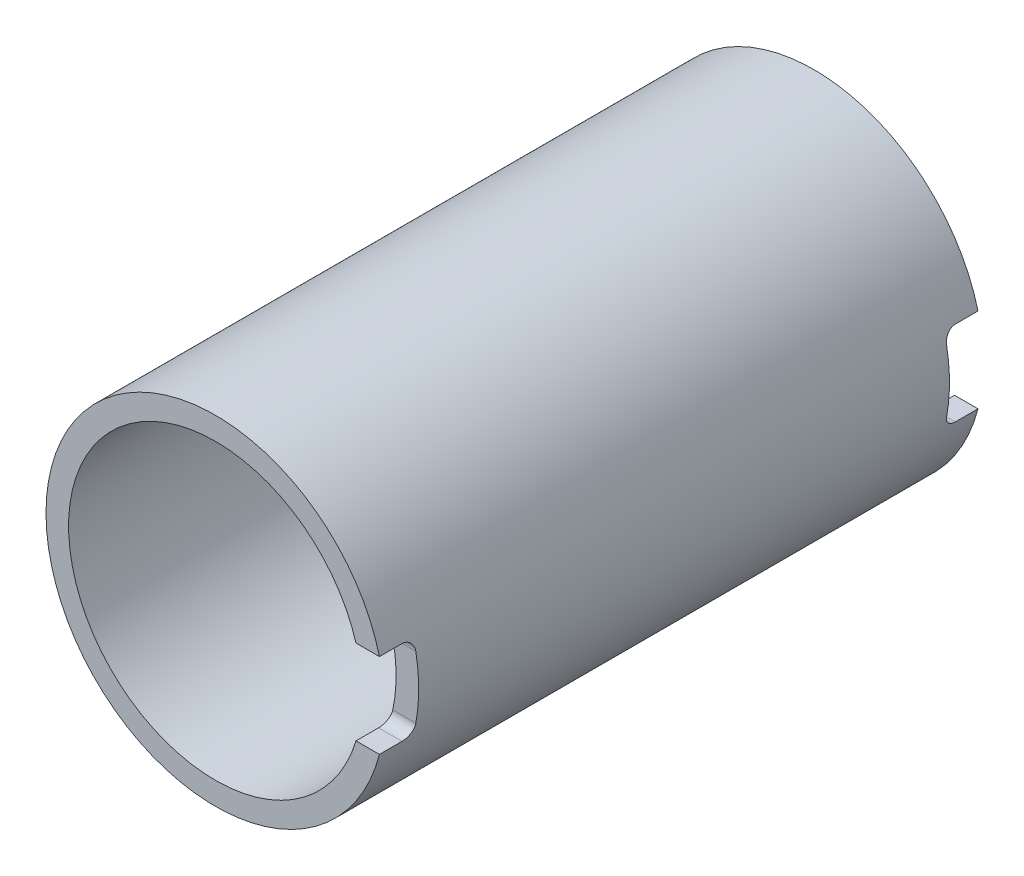
ISO-10303-21;
HEADER;
FILE_DESCRIPTION(('STEP AP214'),'2;1');
FILE_NAME('part.step','',(''),(''),'','','');
FILE_SCHEMA(('AUTOMOTIVE_DESIGN { 1 0 10303 214 1 1 1 1 }'));
ENDSEC;
DATA;
#1=APPLICATION_CONTEXT('core data for automotive mechanical design processes');
#2=APPLICATION_PROTOCOL_DEFINITION('international standard','automotive_design',2000,#1);
#3=PRODUCT_CONTEXT('',#1,'mechanical');
#4=PRODUCT('Part','Part','',(#3));
#5=PRODUCT_RELATED_PRODUCT_CATEGORY('part','',(#4));
#6=PRODUCT_DEFINITION_FORMATION('','',#4);
#7=PRODUCT_DEFINITION_CONTEXT('part definition',#1,'design');
#8=PRODUCT_DEFINITION('design','',#6,#7);
#9=PRODUCT_DEFINITION_SHAPE('','',#8);
#10=(LENGTH_UNIT() NAMED_UNIT(*) SI_UNIT(.MILLI.,.METRE.));
#11=(NAMED_UNIT(*) PLANE_ANGLE_UNIT() SI_UNIT($,.RADIAN.));
#12=(NAMED_UNIT(*) SI_UNIT($,.STERADIAN.) SOLID_ANGLE_UNIT());
#13=UNCERTAINTY_MEASURE_WITH_UNIT(LENGTH_MEASURE(1.E-05),#10,'distance_accuracy_value','');
#14=(GEOMETRIC_REPRESENTATION_CONTEXT(3) GLOBAL_UNCERTAINTY_ASSIGNED_CONTEXT((#13)) GLOBAL_UNIT_ASSIGNED_CONTEXT((#10,
#11,#12)) REPRESENTATION_CONTEXT('',''));
#15=CARTESIAN_POINT('',(0.,0.,0.));
#16=DIRECTION('',(0.,0.,1.));
#17=DIRECTION('',(1.,0.,0.));
#18=AXIS2_PLACEMENT_3D('',#15,#16,#17);
#19=CARTESIAN_POINT('',(0.,0.,26.5));
#20=DIRECTION('',(0.,0.,1.));
#21=DIRECTION('',(1.,0.,0.));
#22=AXIS2_PLACEMENT_3D('',#19,#20,#21);
#23=PLANE('',#22);
#24=CARTESIAN_POINT('',(0.,0.,26.5));
#25=DIRECTION('',(0.,0.,1.));
#26=DIRECTION('',(1.,0.,0.));
#27=AXIS2_PLACEMENT_3D('',#24,#25,#26);
#28=CIRCLE('',#27,15.);
#29=CARTESIAN_POINT('',(14.5236875482778,3.75,26.5));
#30=VERTEX_POINT('',#29);
#31=CARTESIAN_POINT('',(14.5236875482778,-3.75,26.5));
#32=VERTEX_POINT('',#31);
#33=EDGE_CURVE('E11',#30,#32,#28,.T.);
#34=ORIENTED_EDGE('',*,*,#33,.T.);
#35=DIRECTION('',(-1.,0.,0.));
#36=VECTOR('',#35,1.);
#37=CARTESIAN_POINT('',(15.001,-3.75,26.5));
#38=LINE('',#37,#36);
#39=CARTESIAN_POINT('',(12.4473892845046,-3.75,26.5));
#40=VERTEX_POINT('',#39);
#41=EDGE_CURVE('E141',#32,#40,#38,.T.);
#42=ORIENTED_EDGE('',*,*,#41,.T.);
#43=CARTESIAN_POINT('',(0.,0.,26.5));
#44=DIRECTION('',(0.,0.,1.));
#45=DIRECTION('',(1.,0.,0.));
#46=AXIS2_PLACEMENT_3D('',#43,#44,#45);
#47=CIRCLE('',#46,13.);
#48=CARTESIAN_POINT('',(12.4473892845046,3.75,26.5));
#49=VERTEX_POINT('',#48);
#50=EDGE_CURVE('E272',#49,#40,#47,.T.);
#51=ORIENTED_EDGE('',*,*,#50,.F.);
#52=DIRECTION('',(-1.,0.,0.));
#53=VECTOR('',#52,1.);
#54=CARTESIAN_POINT('',(15.001,3.75,26.5));
#55=LINE('',#54,#53);
#56=EDGE_CURVE('E56',#30,#49,#55,.T.);
#57=ORIENTED_EDGE('',*,*,#56,.F.);
#58=EDGE_LOOP('',(#34,#42,#51,#57));
#59=FACE_BOUND('',#58,.T.);
#60=ADVANCED_FACE('F33',(#59),#23,.T.);
#61=CARTESIAN_POINT('',(0.,0.,-26.5));
#62=DIRECTION('',(0.,0.,1.));
#63=DIRECTION('',(1.,0.,0.));
#64=AXIS2_PLACEMENT_3D('',#61,#62,#63);
#65=PLANE('',#64);
#66=DIRECTION('',(-1.,0.,0.));
#67=VECTOR('',#66,1.);
#68=CARTESIAN_POINT('',(15.001,3.75,-26.5));
#69=LINE('',#68,#67);
#70=CARTESIAN_POINT('',(14.5236875482778,3.75,-26.5));
#71=VERTEX_POINT('',#70);
#72=CARTESIAN_POINT('',(12.4473892845046,3.75,-26.5));
#73=VERTEX_POINT('',#72);
#74=EDGE_CURVE('E268',#71,#73,#69,.T.);
#75=ORIENTED_EDGE('',*,*,#74,.T.);
#76=CARTESIAN_POINT('',(0.,0.,-26.5));
#77=DIRECTION('',(0.,0.,1.));
#78=DIRECTION('',(1.,0.,0.));
#79=AXIS2_PLACEMENT_3D('',#76,#77,#78);
#80=CIRCLE('',#79,13.);
#81=CARTESIAN_POINT('',(12.4473892845046,-3.75,-26.5));
#82=VERTEX_POINT('',#81);
#83=EDGE_CURVE('E208',#73,#82,#80,.T.);
#84=ORIENTED_EDGE('',*,*,#83,.T.);
#85=DIRECTION('',(-1.,0.,0.));
#86=VECTOR('',#85,1.);
#87=CARTESIAN_POINT('',(15.001,-3.75,-26.5));
#88=LINE('',#87,#86);
#89=CARTESIAN_POINT('',(14.5236875482778,-3.75,-26.5));
#90=VERTEX_POINT('',#89);
#91=EDGE_CURVE('E48',#90,#82,#88,.T.);
#92=ORIENTED_EDGE('',*,*,#91,.F.);
#93=CARTESIAN_POINT('',(0.,0.,-26.5));
#94=DIRECTION('',(0.,0.,1.));
#95=DIRECTION('',(1.,0.,0.));
#96=AXIS2_PLACEMENT_3D('',#93,#94,#95);
#97=CIRCLE('',#96,15.);
#98=EDGE_CURVE('E37',#71,#90,#97,.T.);
#99=ORIENTED_EDGE('',*,*,#98,.F.);
#100=EDGE_LOOP('',(#75,#84,#92,#99));
#101=FACE_BOUND('',#100,.T.);
#102=ADVANCED_FACE('F277',(#101),#65,.F.);
#103=CARTESIAN_POINT('',(0.,0.,26.5));
#104=DIRECTION('',(0.,0.,-1.));
#105=DIRECTION('',(-1.,0.,0.));
#106=AXIS2_PLACEMENT_3D('',#103,#104,#105);
#107=CYLINDRICAL_SURFACE('',#106,15.);
#108=DIRECTION('',(0.,0.,-1.));
#109=VECTOR('',#108,1.);
#110=CARTESIAN_POINT('',(14.5236875482778,3.75,26.5));
#111=LINE('',#110,#109);
#112=CARTESIAN_POINT('',(14.5236875482778,3.75,-24.5));
#113=VERTEX_POINT('',#112);
#114=EDGE_CURVE('E255',#113,#71,#111,.T.);
#115=ORIENTED_EDGE('',*,*,#114,.T.);
#116=ORIENTED_EDGE('',*,*,#98,.T.);
#117=DIRECTION('',(0.,0.,-1.));
#118=VECTOR('',#117,1.);
#119=CARTESIAN_POINT('',(14.5236875482778,-3.75,26.5));
#120=LINE('',#119,#118);
#121=CARTESIAN_POINT('',(14.5236875482778,-3.75,-24.5));
#122=VERTEX_POINT('',#121);
#123=EDGE_CURVE('E147',#90,#122,#120,.F.);
#124=ORIENTED_EDGE('',*,*,#123,.T.);
#125=CARTESIAN_POINT('',(14.5236875482778,-3.75,-24.5));
#126=CARTESIAN_POINT('',(14.523687009346,-3.75000029271838,-24.4724618045762));
#127=CARTESIAN_POINT('',(14.5239814992384,-3.7488617268363,-24.4449370948382));
#128=CARTESIAN_POINT('',(14.5251525154417,-3.74432270963277,-24.3900907800128));
#129=CARTESIAN_POINT('',(14.5260289676267,-3.74092254637627,-24.3627691495068));
#130=CARTESIAN_POINT('',(14.5295131894071,-3.72737692588563,-24.2815062127906));
#131=CARTESIAN_POINT('',(14.5329759139886,-3.71388614181603,-24.2281191732213));
#132=CARTESIAN_POINT('',(14.5419914215567,-3.67842570469678,-24.1244583399101));
#133=CARTESIAN_POINT('',(14.5475444071387,-3.65645522976012,-24.0741848484946));
#134=CARTESIAN_POINT('',(14.5604480315263,-3.60472761193206,-23.9780625477194));
#135=CARTESIAN_POINT('',(14.5677989066021,-3.5749694455819,-23.9322143210132));
#136=CARTESIAN_POINT('',(14.5840650278986,-3.50802634178349,-23.8454415800296));
#137=CARTESIAN_POINT('',(14.5930031073876,-3.47073172742425,-23.8046060729825));
#138=CARTESIAN_POINT('',(14.6119495721043,-3.39008010416391,-23.7297230364728));
#139=CARTESIAN_POINT('',(14.6219582514298,-3.34672142843173,-23.6956773796023));
#140=CARTESIAN_POINT('',(14.642914605047,-3.25382538889646,-23.6343528187069));
#141=CARTESIAN_POINT('',(14.6538808288068,-3.2041479760962,-23.6072924884732));
#142=CARTESIAN_POINT('',(14.6760538910628,-3.10100304025908,-23.561933947493));
#143=CARTESIAN_POINT('',(14.6872606340417,-3.04753700307032,-23.5436323232953));
#144=CARTESIAN_POINT('',(14.7064587463132,-2.95325409497605,-23.5200194788427));
#145=CARTESIAN_POINT('',(14.7144910138095,-2.91297829202584,-23.5125241642182));
#146=CARTESIAN_POINT('',(14.7303270734774,-2.83181828889743,-23.5025137130429));
#147=CARTESIAN_POINT('',(14.7381311210959,-2.7909348527501,-23.4999927806249));
#148=CARTESIAN_POINT('',(14.7457621030586,-2.75,-23.5));
#149=B_SPLINE_CURVE_WITH_KNOTS('',3,(#125,#126,#127,#128,#129,#130,#131,#132,#133,#134,#135,
#136,#137,#138,#139,#140,#141,#142,#143,#144,#145,#146,#147,#148),.UNSPECIFIED.,.F.,.F.,(4,2,2,
2,2,2,2,2,2,2,2,4),(0.,0.0825628613874054,0.165115208563593,0.32978258198036,0.494465919655328,
0.659170910900011,0.826472217851638,0.993819601694428,1.16589921763363,1.33791171581839,
1.46286599844592,1.58767460528488),.UNSPECIFIED.);
#150=CARTESIAN_POINT('',(14.7457621030586,-2.75,-23.5));
#151=VERTEX_POINT('',#150);
#152=EDGE_CURVE('E292',#122,#151,#149,.T.);
#153=ORIENTED_EDGE('',*,*,#152,.T.);
#154=CARTESIAN_POINT('',(0.,0.,-23.5));
#155=DIRECTION('',(0.,0.,-1.));
#156=DIRECTION('',(-1.,0.,0.));
#157=AXIS2_PLACEMENT_3D('',#154,#155,#156);
#158=CIRCLE('',#157,15.);
#159=CARTESIAN_POINT('',(14.7457621030586,2.74999999999999,-23.5));
#160=VERTEX_POINT('',#159);
#161=EDGE_CURVE('E256',#151,#160,#158,.F.);
#162=ORIENTED_EDGE('',*,*,#161,.T.);
#163=CARTESIAN_POINT('',(14.7457621030586,2.74999999999999,-23.5));
#164=CARTESIAN_POINT('',(14.7350763742763,2.80736888679508,-23.4999581559532));
#165=CARTESIAN_POINT('',(14.724034352876,2.86465078887561,-23.5049338830027));
#166=CARTESIAN_POINT('',(14.7016339649438,2.97744165987913,-23.5245400997557));
#167=CARTESIAN_POINT('',(14.6902757843541,3.0329516313381,-23.5391650247902));
#168=CARTESIAN_POINT('',(14.6676220949194,3.14068847255192,-23.5776968986634));
#169=CARTESIAN_POINT('',(14.6563266096963,3.19291417253336,-23.6016071331775));
#170=CARTESIAN_POINT('',(14.6342562885019,3.29258916168966,-23.6580529060841));
#171=CARTESIAN_POINT('',(14.623481371049,3.34003919963898,-23.6905870894146));
#172=CARTESIAN_POINT('',(14.6029439437899,3.42871720772926,-23.7633672491207));
#173=CARTESIAN_POINT('',(14.5931796904903,3.46995595086186,-23.8035995918559));
#174=CARTESIAN_POINT('',(14.575117552037,3.5450590864144,-23.890747530651));
#175=CARTESIAN_POINT('',(14.5668198272081,3.57892267265592,-23.9376638564108));
#176=CARTESIAN_POINT('',(14.5522862825615,3.63756259334756,-24.035847169761));
#177=CARTESIAN_POINT('',(14.5460122578745,3.66250840521519,-24.087007346503));
#178=CARTESIAN_POINT('',(14.5356564816767,3.70339570745404,-24.1929913644555));
#179=CARTESIAN_POINT('',(14.5315725039703,3.71934634233057,-24.2478114213713));
#180=CARTESIAN_POINT('',(14.5270400411812,3.73699749786692,-24.3359108465384));
#181=CARTESIAN_POINT('',(14.5257848928519,3.74187008163745,-24.3685463292169));
#182=CARTESIAN_POINT('',(14.5241083182736,3.74837053593447,-24.4341156746735));
#183=CARTESIAN_POINT('',(14.5236857772251,3.75000274510502,-24.4670490790845));
#184=CARTESIAN_POINT('',(14.5236875482778,3.75,-24.5));
#185=B_SPLINE_CURVE_WITH_KNOTS('',3,(#163,#164,#165,#166,#167,#168,#169,#170,#171,#172,#173,
#174,#175,#176,#177,#178,#179,#180,#181,#182,#183,#184),.UNSPECIFIED.,.F.,.F.,(4,2,2,2,2,2,2,2,
2,2,4),(0.,0.174825899408982,0.349551065172378,0.524338115151367,0.699097717494169,
0.873550633763859,1.04802260992191,1.2189762944809,1.38975587261729,1.48866393971016,
1.58743948598424),.UNSPECIFIED.);
#186=EDGE_CURVE('E247',#160,#113,#185,.T.);
#187=ORIENTED_EDGE('',*,*,#186,.T.);
#188=EDGE_LOOP('',(#115,#116,#124,#153,#162,#187));
#189=FACE_BOUND('',#188,.T.);
#190=DIRECTION('',(0.,0.,-1.));
#191=VECTOR('',#190,1.);
#192=CARTESIAN_POINT('',(14.5236875482778,-3.75,26.5));
#193=LINE('',#192,#191);
#194=CARTESIAN_POINT('',(14.5236875482778,-3.75,24.5));
#195=VERTEX_POINT('',#194);
#196=EDGE_CURVE('E195',#195,#32,#193,.F.);
#197=ORIENTED_EDGE('',*,*,#196,.T.);
#198=ORIENTED_EDGE('',*,*,#33,.F.);
#199=DIRECTION('',(0.,0.,-1.));
#200=VECTOR('',#199,1.);
#201=CARTESIAN_POINT('',(14.5236875482778,3.75,26.5));
#202=LINE('',#201,#200);
#203=CARTESIAN_POINT('',(14.5236875482778,3.75,24.5));
#204=VERTEX_POINT('',#203);
#205=EDGE_CURVE('E140',#30,#204,#202,.T.);
#206=ORIENTED_EDGE('',*,*,#205,.T.);
#207=CARTESIAN_POINT('',(14.5236875482778,3.75,24.5));
#208=CARTESIAN_POINT('',(14.523687009346,3.75000029271838,24.4724618045762));
#209=CARTESIAN_POINT('',(14.5239814992384,3.74886172683629,24.4449370948382));
#210=CARTESIAN_POINT('',(14.5251525154417,3.74432270963277,24.3900907800128));
#211=CARTESIAN_POINT('',(14.5260289676267,3.74092254637626,24.3627691495068));
#212=CARTESIAN_POINT('',(14.5295131894071,3.72737692588562,24.2815062127906));
#213=CARTESIAN_POINT('',(14.5329759139886,3.71388614181603,24.2281191732213));
#214=CARTESIAN_POINT('',(14.5419914215567,3.67842570469677,24.1244583399101));
#215=CARTESIAN_POINT('',(14.5475444071388,3.65645522976011,24.0741848484946));
#216=CARTESIAN_POINT('',(14.5604480315263,3.60472761193205,23.9780625477194));
#217=CARTESIAN_POINT('',(14.5677989066021,3.57496944558189,23.9322143210132));
#218=CARTESIAN_POINT('',(14.5840650278986,3.50802634178348,23.8454415800296));
#219=CARTESIAN_POINT('',(14.5930031073876,3.47073172742424,23.8046060729825));
#220=CARTESIAN_POINT('',(14.6119495721043,3.3900801041639,23.7297230364728));
#221=CARTESIAN_POINT('',(14.6219582514298,3.34672142843172,23.6956773796023));
#222=CARTESIAN_POINT('',(14.642914605047,3.25382538889645,23.6343528187069));
#223=CARTESIAN_POINT('',(14.6538808288068,3.20414797609619,23.6072924884732));
#224=CARTESIAN_POINT('',(14.6760538910628,3.10100304025908,23.561933947493));
#225=CARTESIAN_POINT('',(14.6872606340417,3.04753700307032,23.5436323232953));
#226=CARTESIAN_POINT('',(14.7064587463132,2.95325409497605,23.5200194788427));
#227=CARTESIAN_POINT('',(14.7144910138095,2.91297829202583,23.5125241642182));
#228=CARTESIAN_POINT('',(14.7303270734774,2.83181828889742,23.5025137130429));
#229=CARTESIAN_POINT('',(14.7381311210959,2.79093485275009,23.4999927806249));
#230=CARTESIAN_POINT('',(14.7457621030586,2.74999999999999,23.5));
#231=B_SPLINE_CURVE_WITH_KNOTS('',3,(#207,#208,#209,#210,#211,#212,#213,#214,#215,#216,#217,
#218,#219,#220,#221,#222,#223,#224,#225,#226,#227,#228,#229,#230),.UNSPECIFIED.,.F.,.F.,(4,2,2,
2,2,2,2,2,2,2,2,4),(0.,0.0825628613874054,0.165115208563593,0.32978258198036,0.494465919655328,
0.659170910900011,0.826472217851643,0.993819601694428,1.16589921763363,1.33791171581839,
1.46286599844593,1.58767460528489),.UNSPECIFIED.);
#232=CARTESIAN_POINT('',(14.7457621030586,2.74999999999999,23.5));
#233=VERTEX_POINT('',#232);
#234=EDGE_CURVE('E131',#204,#233,#231,.T.);
#235=ORIENTED_EDGE('',*,*,#234,.T.);
#236=CARTESIAN_POINT('',(0.,0.,23.5));
#237=DIRECTION('',(0.,0.,1.));
#238=DIRECTION('',(1.,0.,0.));
#239=AXIS2_PLACEMENT_3D('',#236,#237,#238);
#240=CIRCLE('',#239,15.);
#241=CARTESIAN_POINT('',(14.7457621030586,-2.75,23.5));
#242=VERTEX_POINT('',#241);
#243=EDGE_CURVE('E196',#233,#242,#240,.F.);
#244=ORIENTED_EDGE('',*,*,#243,.T.);
#245=CARTESIAN_POINT('',(14.7457621030586,-2.75,23.5));
#246=CARTESIAN_POINT('',(14.7350763742763,-2.80736888679509,23.4999581559532));
#247=CARTESIAN_POINT('',(14.724034352876,-2.86465078887563,23.5049338830027));
#248=CARTESIAN_POINT('',(14.7016339649438,-2.97744165987914,23.5245400997557));
#249=CARTESIAN_POINT('',(14.6902757843541,-3.03295163133812,23.5391650247902));
#250=CARTESIAN_POINT('',(14.6676220949194,-3.14068847255193,23.5776968986634));
#251=CARTESIAN_POINT('',(14.6563266096963,-3.19291417253337,23.6016071331775));
#252=CARTESIAN_POINT('',(14.6342562885018,-3.29258916168967,23.6580529060841));
#253=CARTESIAN_POINT('',(14.6234813710489,-3.34003919963899,23.6905870894146));
#254=CARTESIAN_POINT('',(14.6029439437899,-3.42871720772928,23.7633672491207));
#255=CARTESIAN_POINT('',(14.5931796904903,-3.46995595086187,23.8035995918559));
#256=CARTESIAN_POINT('',(14.575117552037,-3.54505908641441,23.890747530651));
#257=CARTESIAN_POINT('',(14.5668198272081,-3.57892267265593,23.9376638564108));
#258=CARTESIAN_POINT('',(14.5522862825615,-3.63756259334757,24.035847169761));
#259=CARTESIAN_POINT('',(14.5460122578745,-3.6625084052152,24.087007346503));
#260=CARTESIAN_POINT('',(14.5356564816767,-3.70339570745404,24.1929913644555));
#261=CARTESIAN_POINT('',(14.5315725039703,-3.71934634233058,24.2478114213714));
#262=CARTESIAN_POINT('',(14.5270400411812,-3.73699749786693,24.3359108465384));
#263=CARTESIAN_POINT('',(14.5257848928519,-3.74187008163746,24.3685463292169));
#264=CARTESIAN_POINT('',(14.5241083182736,-3.74837053593448,24.4341156746736));
#265=CARTESIAN_POINT('',(14.5236857772251,-3.75000274510503,24.4670490790845));
#266=CARTESIAN_POINT('',(14.5236875482778,-3.75,24.5));
#267=B_SPLINE_CURVE_WITH_KNOTS('',3,(#245,#246,#247,#248,#249,#250,#251,#252,#253,#254,#255,
#256,#257,#258,#259,#260,#261,#262,#263,#264,#265,#266),.UNSPECIFIED.,.F.,.F.,(4,2,2,2,2,2,2,2,
2,2,4),(0.,0.174825899408983,0.349551065172377,0.524338115151366,0.699097717494169,
0.873550633763858,1.04802260992191,1.2189762944809,1.38975587261729,1.48866393971015,
1.58743948598423),.UNSPECIFIED.);
#268=EDGE_CURVE('E187',#242,#195,#267,.T.);
#269=ORIENTED_EDGE('',*,*,#268,.T.);
#270=EDGE_LOOP('',(#197,#198,#206,#235,#244,#269));
#271=FACE_BOUND('',#270,.T.);
#272=ADVANCED_FACE('F35',(#189,#271),#107,.T.);
#273=CARTESIAN_POINT('',(0.,0.,26.5));
#274=DIRECTION('',(0.,0.,-1.));
#275=DIRECTION('',(-1.,0.,0.));
#276=AXIS2_PLACEMENT_3D('',#273,#274,#275);
#277=CYLINDRICAL_SURFACE('',#276,13.);
#278=ORIENTED_EDGE('',*,*,#83,.F.);
#279=DIRECTION('',(0.,0.,-1.));
#280=VECTOR('',#279,1.);
#281=CARTESIAN_POINT('',(12.4473892845046,3.75,26.5));
#282=LINE('',#281,#280);
#283=CARTESIAN_POINT('',(12.4473892845046,3.75,-24.5));
#284=VERTEX_POINT('',#283);
#285=EDGE_CURVE('E235',#284,#73,#282,.T.);
#286=ORIENTED_EDGE('',*,*,#285,.F.);
#287=CARTESIAN_POINT('',(12.7058057595731,2.74999999999999,-23.5));
#288=CARTESIAN_POINT('',(12.6933209808571,2.80775590027258,-23.4999603527028));
#289=CARTESIAN_POINT('',(12.6804176093399,2.86539822366334,-23.5050006907049));
#290=CARTESIAN_POINT('',(12.6542356674675,2.97885908256431,-23.5248503475645));
#291=CARTESIAN_POINT('',(12.6409572920542,3.03467853427896,-23.5396546770307));
#292=CARTESIAN_POINT('',(12.6144695855884,3.14297581406801,-23.5786480603185));
#293=CARTESIAN_POINT('',(12.601260276979,3.19545261122669,-23.6028399932339));
#294=CARTESIAN_POINT('',(12.5754467299287,3.29557383309096,-23.6599592160227));
#295=CARTESIAN_POINT('',(12.5628424041456,3.34321895646366,-23.6928852404367));
#296=CARTESIAN_POINT('',(12.5388275776592,3.43218982155202,-23.7665523736575));
#297=CARTESIAN_POINT('',(12.5274143877439,3.47352989999954,-23.8072752628059));
#298=CARTESIAN_POINT('',(12.5063188020619,3.54873487592473,-23.8955316321808));
#299=CARTESIAN_POINT('',(12.4966365332837,3.58259922499048,-23.9430656116404));
#300=CARTESIAN_POINT('',(12.4797802952659,3.640876593416,-24.0422257968581));
#301=CARTESIAN_POINT('',(12.4725450455854,3.66552247197443,-24.0937047907964));
#302=CARTESIAN_POINT('',(12.4606547211799,3.70574264838077,-24.200344171218));
#303=CARTESIAN_POINT('',(12.4559966219684,3.72132758105124,-24.2555001568822));
#304=CARTESIAN_POINT('',(12.4509857396422,3.73804631395278,-24.3426284410732));
#305=CARTESIAN_POINT('',(12.4496391894067,3.74252583769221,-24.3739392785323));
#306=CARTESIAN_POINT('',(12.4478407126788,3.74850176908604,-24.4368278743971));
#307=CARTESIAN_POINT('',(12.4473876077206,3.75000210634373,-24.4684052259469));
#308=CARTESIAN_POINT('',(12.4473892845046,3.75,-24.5));
#309=B_SPLINE_CURVE_WITH_KNOTS('',3,(#287,#288,#289,#290,#291,#292,#293,#294,#295,#296,#297,
#298,#299,#300,#301,#302,#303,#304,#305,#306,#307,#308),.UNSPECIFIED.,.F.,.F.,(4,2,2,2,2,2,2,2,
2,2,4),(0.,0.177022618750042,0.353954849108013,0.530941385938482,0.707902293653672,
0.884454618980543,1.06101989170623,1.2327631520051,1.404304428353,1.49914110977594,
1.59385261650842),.UNSPECIFIED.);
#310=CARTESIAN_POINT('',(12.7058057595731,2.74999999999999,-23.5));
#311=VERTEX_POINT('',#310);
#312=EDGE_CURVE('E227',#311,#284,#309,.T.);
#313=ORIENTED_EDGE('',*,*,#312,.F.);
#314=CARTESIAN_POINT('',(0.,0.,-23.5));
#315=DIRECTION('',(0.,0.,-1.));
#316=DIRECTION('',(-1.,0.,0.));
#317=AXIS2_PLACEMENT_3D('',#314,#315,#316);
#318=CIRCLE('',#317,13.);
#319=CARTESIAN_POINT('',(12.7058057595731,-2.75,-23.5));
#320=VERTEX_POINT('',#319);
#321=EDGE_CURVE('E217',#320,#311,#318,.F.);
#322=ORIENTED_EDGE('',*,*,#321,.F.);
#323=CARTESIAN_POINT('',(12.4473892845046,-3.75,-24.5));
#324=CARTESIAN_POINT('',(12.4473886117547,-3.75000044802611,-24.472662560525));
#325=CARTESIAN_POINT('',(12.4477272884932,-3.74887825249582,-24.4453386157192));
#326=CARTESIAN_POINT('',(12.4490736604915,-3.74440557427478,-24.3908945201417));
#327=CARTESIAN_POINT('',(12.4500812521574,-3.74105543662212,-24.3637743384712));
#328=CARTESIAN_POINT('',(12.4540850822,-3.72771460257419,-24.2831321707766));
#329=CARTESIAN_POINT('',(12.4580624978861,-3.71443324832023,-24.2301638016546));
#330=CARTESIAN_POINT('',(12.4684086293589,-3.67955330447621,-24.1273294376834));
#331=CARTESIAN_POINT('',(12.4747772640744,-3.65795499686142,-24.0774633377223));
#332=CARTESIAN_POINT('',(12.4895642741954,-3.60714318779988,-23.9820961280535));
#333=CARTESIAN_POINT('',(12.4979831244209,-3.57792792219181,-23.936596032899));
#334=CARTESIAN_POINT('',(12.5166483862308,-3.51207988773061,-23.8501948077439));
#335=CARTESIAN_POINT('',(12.5269293846457,-3.47530456804179,-23.8094099717965));
#336=CARTESIAN_POINT('',(12.5487190980409,-3.39578364075772,-23.7345278302594));
#337=CARTESIAN_POINT('',(12.5602281772141,-3.35303626095184,-23.7004325170353));
#338=CARTESIAN_POINT('',(12.5844438831369,-3.26099956210076,-23.6385652348547));
#339=CARTESIAN_POINT('',(12.5971793826262,-3.21152352899079,-23.6110823743566));
#340=CARTESIAN_POINT('',(12.6229409772984,-3.10872401678755,-23.5648578774634));
#341=CARTESIAN_POINT('',(12.6359669770256,-3.0554017890162,-23.5461134127959));
#342=CARTESIAN_POINT('',(12.6586029241155,-2.95998935211754,-23.52138327895));
#343=CARTESIAN_POINT('',(12.6682535721165,-2.91841972871408,-23.513380330732));
#344=CARTESIAN_POINT('',(12.6872763271244,-2.83458848211385,-23.5026875032559));
#345=CARTESIAN_POINT('',(12.6966487221107,-2.7923276499477,-23.4999919278519));
#346=CARTESIAN_POINT('',(12.7058057595731,-2.75,-23.5));
#347=B_SPLINE_CURVE_WITH_KNOTS('',3,(#323,#324,#325,#326,#327,#328,#329,#330,#331,#332,#333,
#334,#335,#336,#337,#338,#339,#340,#341,#342,#343,#344,#345,#346),.UNSPECIFIED.,.F.,.F.,(4,2,2,
2,2,2,2,2,2,2,2,4),(0.,0.0819606132527921,0.163908536342446,0.327316550813048,0.49071902563966,
0.654159379736032,0.821023196914794,0.987936636578271,1.16118506665519,1.33437738408426,
1.46431711198891,1.59411730570381),.UNSPECIFIED.);
#348=CARTESIAN_POINT('',(12.4473892845046,-3.75,-24.5));
#349=VERTEX_POINT('',#348);
#350=EDGE_CURVE('E209',#349,#320,#347,.T.);
#351=ORIENTED_EDGE('',*,*,#350,.F.);
#352=DIRECTION('',(0.,0.,-1.));
#353=VECTOR('',#352,1.);
#354=CARTESIAN_POINT('',(12.4473892845046,-3.75,26.5));
#355=LINE('',#354,#353);
#356=EDGE_CURVE('E152',#82,#349,#355,.F.);
#357=ORIENTED_EDGE('',*,*,#356,.F.);
#358=EDGE_LOOP('',(#278,#286,#313,#322,#351,#357));
#359=FACE_BOUND('',#358,.T.);
#360=ORIENTED_EDGE('',*,*,#50,.T.);
#361=DIRECTION('',(0.,0.,-1.));
#362=VECTOR('',#361,1.);
#363=CARTESIAN_POINT('',(12.4473892845046,-3.75,26.5));
#364=LINE('',#363,#362);
#365=CARTESIAN_POINT('',(12.4473892845046,-3.75,24.5));
#366=VERTEX_POINT('',#365);
#367=EDGE_CURVE('E175',#366,#40,#364,.F.);
#368=ORIENTED_EDGE('',*,*,#367,.F.);
#369=CARTESIAN_POINT('',(12.7058057595731,-2.75,23.5));
#370=CARTESIAN_POINT('',(12.693320980857,-2.80775590027259,23.4999603527028));
#371=CARTESIAN_POINT('',(12.6804176093399,-2.86539822366335,23.5050006907049));
#372=CARTESIAN_POINT('',(12.6542356674675,-2.97885908256432,23.5248503475645));
#373=CARTESIAN_POINT('',(12.6409572920542,-3.03467853427897,23.5396546770307));
#374=CARTESIAN_POINT('',(12.6144695855884,-3.14297581406802,23.5786480603185));
#375=CARTESIAN_POINT('',(12.601260276979,-3.19545261122671,23.6028399932339));
#376=CARTESIAN_POINT('',(12.5754467299287,-3.29557383309097,23.6599592160227));
#377=CARTESIAN_POINT('',(12.5628424041456,-3.34321895646367,23.6928852404367));
#378=CARTESIAN_POINT('',(12.5388275776592,-3.43218982155204,23.7665523736575));
#379=CARTESIAN_POINT('',(12.5274143877439,-3.47352989999955,23.8072752628059));
#380=CARTESIAN_POINT('',(12.5063188020619,-3.54873487592474,23.8955316321808));
#381=CARTESIAN_POINT('',(12.4966365332837,-3.58259922499049,23.9430656116404));
#382=CARTESIAN_POINT('',(12.4797802952659,-3.64087659341601,24.0422257968581));
#383=CARTESIAN_POINT('',(12.4725450455854,-3.66552247197444,24.0937047907964));
#384=CARTESIAN_POINT('',(12.4606547211799,-3.70574264838078,24.200344171218));
#385=CARTESIAN_POINT('',(12.4559966219684,-3.72132758105125,24.2555001568822));
#386=CARTESIAN_POINT('',(12.4509857396422,-3.73804631395279,24.3426284410732));
#387=CARTESIAN_POINT('',(12.4496391894067,-3.74252583769222,24.3739392785323));
#388=CARTESIAN_POINT('',(12.4478407126788,-3.74850176908604,24.4368278743971));
#389=CARTESIAN_POINT('',(12.4473876077206,-3.75000210634373,24.4684052259469));
#390=CARTESIAN_POINT('',(12.4473892845046,-3.75,24.5));
#391=B_SPLINE_CURVE_WITH_KNOTS('',3,(#369,#370,#371,#372,#373,#374,#375,#376,#377,#378,#379,
#380,#381,#382,#383,#384,#385,#386,#387,#388,#389,#390),.UNSPECIFIED.,.F.,.F.,(4,2,2,2,2,2,2,2,
2,2,4),(0.,0.177022618750041,0.353954849108013,0.530941385938483,0.707902293653672,
0.884454618980546,1.06101989170623,1.2327631520051,1.40430442835299,1.49914110977594,
1.59385261650842),.UNSPECIFIED.);
#392=CARTESIAN_POINT('',(12.7058057595731,-2.75,23.5));
#393=VERTEX_POINT('',#392);
#394=EDGE_CURVE('E149',#393,#366,#391,.T.);
#395=ORIENTED_EDGE('',*,*,#394,.F.);
#396=CARTESIAN_POINT('',(0.,0.,23.5));
#397=DIRECTION('',(0.,0.,1.));
#398=DIRECTION('',(1.,0.,0.));
#399=AXIS2_PLACEMENT_3D('',#396,#397,#398);
#400=CIRCLE('',#399,13.);
#401=CARTESIAN_POINT('',(12.7058057595731,2.74999999999999,23.5));
#402=VERTEX_POINT('',#401);
#403=EDGE_CURVE('E146',#402,#393,#400,.F.);
#404=ORIENTED_EDGE('',*,*,#403,.F.);
#405=CARTESIAN_POINT('',(12.4473892845046,3.75,24.5));
#406=CARTESIAN_POINT('',(12.4473886117547,3.7500004480261,24.472662560525));
#407=CARTESIAN_POINT('',(12.4477272884932,3.74887825249581,24.4453386157192));
#408=CARTESIAN_POINT('',(12.4490736604915,3.74440557427478,24.3908945201417));
#409=CARTESIAN_POINT('',(12.4500812521574,3.74105543662211,24.3637743384712));
#410=CARTESIAN_POINT('',(12.4540850822,3.72771460257419,24.2831321707766));
#411=CARTESIAN_POINT('',(12.4580624978861,3.71443324832022,24.2301638016546));
#412=CARTESIAN_POINT('',(12.4684086293589,3.67955330447621,24.1273294376833));
#413=CARTESIAN_POINT('',(12.4747772640744,3.65795499686141,24.0774633377223));
#414=CARTESIAN_POINT('',(12.4895642741954,3.60714318779987,23.9820961280535));
#415=CARTESIAN_POINT('',(12.4979831244209,3.5779279221918,23.936596032899));
#416=CARTESIAN_POINT('',(12.5166483862308,3.51207988773061,23.8501948077439));
#417=CARTESIAN_POINT('',(12.5269293846457,3.47530456804178,23.8094099717965));
#418=CARTESIAN_POINT('',(12.5487190980409,3.39578364075771,23.7345278302594));
#419=CARTESIAN_POINT('',(12.5602281772141,3.35303626095183,23.7004325170353));
#420=CARTESIAN_POINT('',(12.5844438831369,3.26099956210075,23.6385652348547));
#421=CARTESIAN_POINT('',(12.5971793826262,3.21152352899079,23.6110823743566));
#422=CARTESIAN_POINT('',(12.6229409772984,3.10872401678754,23.5648578774634));
#423=CARTESIAN_POINT('',(12.6359669770256,3.0554017890162,23.5461134127959));
#424=CARTESIAN_POINT('',(12.6586029241155,2.95998935211754,23.52138327895));
#425=CARTESIAN_POINT('',(12.6682535721165,2.91841972871407,23.513380330732));
#426=CARTESIAN_POINT('',(12.6872763271244,2.83458848211384,23.5026875032559));
#427=CARTESIAN_POINT('',(12.6966487221107,2.79232764994769,23.4999919278519));
#428=CARTESIAN_POINT('',(12.7058057595731,2.74999999999999,23.5));
#429=B_SPLINE_CURVE_WITH_KNOTS('',3,(#405,#406,#407,#408,#409,#410,#411,#412,#413,#414,#415,
#416,#417,#418,#419,#420,#421,#422,#423,#424,#425,#426,#427,#428),.UNSPECIFIED.,.F.,.F.,(4,2,2,
2,2,2,2,2,2,2,2,4),(0.,0.0819606132527921,0.163908536342446,0.327316550813048,0.490719025639668,
0.654159379736033,0.821023196914793,0.987936636578271,1.16118506665519,1.33437738408426,
1.46431711198891,1.59411730570382),.UNSPECIFIED.);
#430=CARTESIAN_POINT('',(12.4473892845046,3.75,24.5));
#431=VERTEX_POINT('',#430);
#432=EDGE_CURVE('E128',#431,#402,#429,.T.);
#433=ORIENTED_EDGE('',*,*,#432,.F.);
#434=DIRECTION('',(0.,0.,-1.));
#435=VECTOR('',#434,1.);
#436=CARTESIAN_POINT('',(12.4473892845046,3.75,26.5));
#437=LINE('',#436,#435);
#438=EDGE_CURVE('E135',#49,#431,#437,.T.);
#439=ORIENTED_EDGE('',*,*,#438,.F.);
#440=EDGE_LOOP('',(#360,#368,#395,#404,#433,#439));
#441=FACE_BOUND('',#440,.T.);
#442=ADVANCED_FACE('F143',(#359,#441),#277,.F.);
#443=CARTESIAN_POINT('',(15.001,3.75,-24.5));
#444=DIRECTION('',(0.,-1.,0.));
#445=DIRECTION('',(0.,0.,-1.));
#446=AXIS2_PLACEMENT_3D('',#443,#444,#445);
#447=PLANE('',#446);
#448=DIRECTION('',(-1.,0.,0.));
#449=VECTOR('',#448,1.);
#450=CARTESIAN_POINT('',(15.001,3.75,-24.5));
#451=LINE('',#450,#449);
#452=EDGE_CURVE('E266',#113,#284,#451,.T.);
#453=ORIENTED_EDGE('',*,*,#452,.T.);
#454=ORIENTED_EDGE('',*,*,#285,.T.);
#455=ORIENTED_EDGE('',*,*,#74,.F.);
#456=ORIENTED_EDGE('',*,*,#114,.F.);
#457=EDGE_LOOP('',(#453,#454,#455,#456));
#458=FACE_BOUND('',#457,.T.);
#459=ADVANCED_FACE('F242',(#458),#447,.T.);
#460=CARTESIAN_POINT('',(15.001,2.75,-24.5));
#461=DIRECTION('',(-1.,0.,0.));
#462=DIRECTION('',(0.,0.,1.));
#463=AXIS2_PLACEMENT_3D('',#460,#461,#462);
#464=CYLINDRICAL_SURFACE('',#463,1.);
#465=DIRECTION('',(-1.,0.,0.));
#466=VECTOR('',#465,1.);
#467=CARTESIAN_POINT('',(15.001,2.74999999999999,-23.5));
#468=LINE('',#467,#466);
#469=EDGE_CURVE('E264',#160,#311,#468,.T.);
#470=ORIENTED_EDGE('',*,*,#469,.T.);
#471=ORIENTED_EDGE('',*,*,#312,.T.);
#472=ORIENTED_EDGE('',*,*,#452,.F.);
#473=ORIENTED_EDGE('',*,*,#186,.F.);
#474=EDGE_LOOP('',(#470,#471,#472,#473));
#475=FACE_BOUND('',#474,.T.);
#476=ADVANCED_FACE('F237',(#475),#464,.F.);
#477=CARTESIAN_POINT('',(15.001,-2.75,-23.5));
#478=DIRECTION('',(0.,0.,-1.));
#479=DIRECTION('',(-1.,0.,0.));
#480=AXIS2_PLACEMENT_3D('',#477,#478,#479);
#481=PLANE('',#480);
#482=DIRECTION('',(-1.,0.,0.));
#483=VECTOR('',#482,1.);
#484=CARTESIAN_POINT('',(15.001,-2.75,-23.5));
#485=LINE('',#484,#483);
#486=EDGE_CURVE('E262',#151,#320,#485,.T.);
#487=ORIENTED_EDGE('',*,*,#486,.T.);
#488=ORIENTED_EDGE('',*,*,#321,.T.);
#489=ORIENTED_EDGE('',*,*,#469,.F.);
#490=ORIENTED_EDGE('',*,*,#161,.F.);
#491=EDGE_LOOP('',(#487,#488,#489,#490));
#492=FACE_BOUND('',#491,.T.);
#493=ADVANCED_FACE('F241',(#492),#481,.T.);
#494=CARTESIAN_POINT('',(15.001,-2.75,-24.5));
#495=DIRECTION('',(-1.,0.,0.));
#496=DIRECTION('',(0.,0.,1.));
#497=AXIS2_PLACEMENT_3D('',#494,#495,#496);
#498=CYLINDRICAL_SURFACE('',#497,1.);
#499=DIRECTION('',(-1.,0.,0.));
#500=VECTOR('',#499,1.);
#501=CARTESIAN_POINT('',(15.001,-3.75,-24.5));
#502=LINE('',#501,#500);
#503=EDGE_CURVE('E260',#122,#349,#502,.T.);
#504=ORIENTED_EDGE('',*,*,#503,.T.);
#505=ORIENTED_EDGE('',*,*,#350,.T.);
#506=ORIENTED_EDGE('',*,*,#486,.F.);
#507=ORIENTED_EDGE('',*,*,#152,.F.);
#508=EDGE_LOOP('',(#504,#505,#506,#507));
#509=FACE_BOUND('',#508,.T.);
#510=ADVANCED_FACE('F219',(#509),#498,.F.);
#511=CARTESIAN_POINT('',(15.001,-3.75,-26.5));
#512=DIRECTION('',(0.,1.,0.));
#513=DIRECTION('',(0.,0.,1.));
#514=AXIS2_PLACEMENT_3D('',#511,#512,#513);
#515=PLANE('',#514);
#516=ORIENTED_EDGE('',*,*,#91,.T.);
#517=ORIENTED_EDGE('',*,*,#356,.T.);
#518=ORIENTED_EDGE('',*,*,#503,.F.);
#519=ORIENTED_EDGE('',*,*,#123,.F.);
#520=EDGE_LOOP('',(#516,#517,#518,#519));
#521=FACE_BOUND('',#520,.T.);
#522=ADVANCED_FACE('F286',(#521),#515,.T.);
#523=CARTESIAN_POINT('',(15.001,-3.75,26.5));
#524=DIRECTION('',(0.,1.,0.));
#525=DIRECTION('',(0.,0.,1.));
#526=AXIS2_PLACEMENT_3D('',#523,#524,#525);
#527=PLANE('',#526);
#528=DIRECTION('',(-1.,0.,0.));
#529=VECTOR('',#528,1.);
#530=CARTESIAN_POINT('',(15.001,-3.75,24.5));
#531=LINE('',#530,#529);
#532=EDGE_CURVE('E203',#195,#366,#531,.T.);
#533=ORIENTED_EDGE('',*,*,#532,.T.);
#534=ORIENTED_EDGE('',*,*,#367,.T.);
#535=ORIENTED_EDGE('',*,*,#41,.F.);
#536=ORIENTED_EDGE('',*,*,#196,.F.);
#537=EDGE_LOOP('',(#533,#534,#535,#536));
#538=FACE_BOUND('',#537,.T.);
#539=ADVANCED_FACE('F182',(#538),#527,.T.);
#540=CARTESIAN_POINT('',(15.001,-2.75,24.5));
#541=DIRECTION('',(-1.,0.,0.));
#542=DIRECTION('',(0.,0.,1.));
#543=AXIS2_PLACEMENT_3D('',#540,#541,#542);
#544=CYLINDRICAL_SURFACE('',#543,1.);
#545=DIRECTION('',(-1.,0.,0.));
#546=VECTOR('',#545,1.);
#547=CARTESIAN_POINT('',(15.001,-2.75,23.5));
#548=LINE('',#547,#546);
#549=EDGE_CURVE('E201',#242,#393,#548,.T.);
#550=ORIENTED_EDGE('',*,*,#549,.T.);
#551=ORIENTED_EDGE('',*,*,#394,.T.);
#552=ORIENTED_EDGE('',*,*,#532,.F.);
#553=ORIENTED_EDGE('',*,*,#268,.F.);
#554=EDGE_LOOP('',(#550,#551,#552,#553));
#555=FACE_BOUND('',#554,.T.);
#556=ADVANCED_FACE('F177',(#555),#544,.F.);
#557=CARTESIAN_POINT('',(15.001,-2.75,23.5));
#558=DIRECTION('',(0.,0.,1.));
#559=DIRECTION('',(1.,0.,0.));
#560=AXIS2_PLACEMENT_3D('',#557,#558,#559);
#561=PLANE('',#560);
#562=DIRECTION('',(-1.,0.,0.));
#563=VECTOR('',#562,1.);
#564=CARTESIAN_POINT('',(15.001,2.74999999999999,23.5));
#565=LINE('',#564,#563);
#566=EDGE_CURVE('E133',#233,#402,#565,.T.);
#567=ORIENTED_EDGE('',*,*,#566,.T.);
#568=ORIENTED_EDGE('',*,*,#403,.T.);
#569=ORIENTED_EDGE('',*,*,#549,.F.);
#570=ORIENTED_EDGE('',*,*,#243,.F.);
#571=EDGE_LOOP('',(#567,#568,#569,#570));
#572=FACE_BOUND('',#571,.T.);
#573=ADVANCED_FACE('F181',(#572),#561,.T.);
#574=CARTESIAN_POINT('',(15.001,2.75,24.5));
#575=DIRECTION('',(-1.,0.,0.));
#576=DIRECTION('',(0.,0.,1.));
#577=AXIS2_PLACEMENT_3D('',#574,#575,#576);
#578=CYLINDRICAL_SURFACE('',#577,1.);
#579=DIRECTION('',(-1.,0.,0.));
#580=VECTOR('',#579,1.);
#581=CARTESIAN_POINT('',(15.001,3.75,24.5));
#582=LINE('',#581,#580);
#583=EDGE_CURVE('E124',#204,#431,#582,.T.);
#584=ORIENTED_EDGE('',*,*,#583,.T.);
#585=ORIENTED_EDGE('',*,*,#432,.T.);
#586=ORIENTED_EDGE('',*,*,#566,.F.);
#587=ORIENTED_EDGE('',*,*,#234,.F.);
#588=EDGE_LOOP('',(#584,#585,#586,#587));
#589=FACE_BOUND('',#588,.T.);
#590=ADVANCED_FACE('F125',(#589),#578,.F.);
#591=CARTESIAN_POINT('',(15.001,3.75,24.5));
#592=DIRECTION('',(0.,-1.,0.));
#593=DIRECTION('',(0.,0.,-1.));
#594=AXIS2_PLACEMENT_3D('',#591,#592,#593);
#595=PLANE('',#594);
#596=ORIENTED_EDGE('',*,*,#56,.T.);
#597=ORIENTED_EDGE('',*,*,#438,.T.);
#598=ORIENTED_EDGE('',*,*,#583,.F.);
#599=ORIENTED_EDGE('',*,*,#205,.F.);
#600=EDGE_LOOP('',(#596,#597,#598,#599));
#601=FACE_BOUND('',#600,.T.);
#602=ADVANCED_FACE('F136',(#601),#595,.T.);
#603=CLOSED_SHELL('',(#60,#102,#272,#442,#459,#476,#493,#510,#522,#539,#556,#573,#590,#602));
#604=MANIFOLD_SOLID_BREP('B2',#603);
#605=ADVANCED_BREP_SHAPE_REPRESENTATION('',(#18,#604),#14);
#606=SHAPE_DEFINITION_REPRESENTATION(#9,#605);
ENDSEC;
END-ISO-10303-21;
